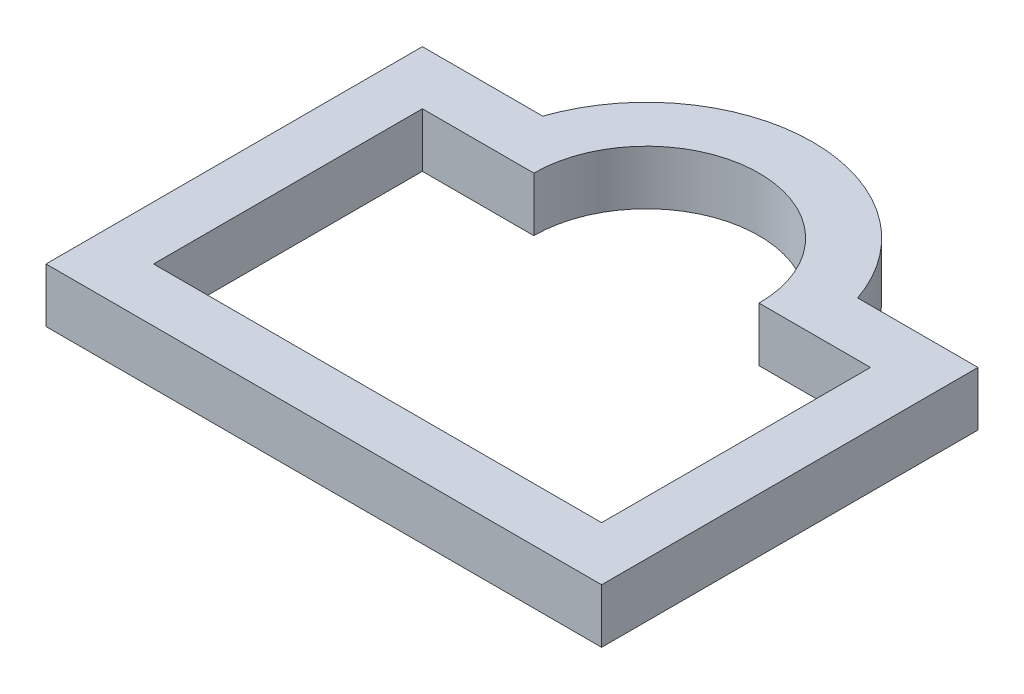
ISO-10303-21;
HEADER;
FILE_DESCRIPTION(('STEP AP214'),'2;1');
FILE_NAME('part.step','',(''),(''),'','','');
FILE_SCHEMA(('AUTOMOTIVE_DESIGN { 1 0 10303 214 1 1 1 1 }'));
ENDSEC;
DATA;
#1=APPLICATION_CONTEXT('core data for automotive mechanical design processes');
#2=APPLICATION_PROTOCOL_DEFINITION('international standard','automotive_design',2000,#1);
#3=PRODUCT_CONTEXT('',#1,'mechanical');
#4=PRODUCT('Part','Part','',(#3));
#5=PRODUCT_RELATED_PRODUCT_CATEGORY('part','',(#4));
#6=PRODUCT_DEFINITION_FORMATION('','',#4);
#7=PRODUCT_DEFINITION_CONTEXT('part definition',#1,'design');
#8=PRODUCT_DEFINITION('design','',#6,#7);
#9=PRODUCT_DEFINITION_SHAPE('','',#8);
#10=(LENGTH_UNIT() NAMED_UNIT(*) SI_UNIT(.MILLI.,.METRE.));
#11=(NAMED_UNIT(*) PLANE_ANGLE_UNIT() SI_UNIT($,.RADIAN.));
#12=(NAMED_UNIT(*) SI_UNIT($,.STERADIAN.) SOLID_ANGLE_UNIT());
#13=UNCERTAINTY_MEASURE_WITH_UNIT(LENGTH_MEASURE(1.E-05),#10,'distance_accuracy_value','');
#14=(GEOMETRIC_REPRESENTATION_CONTEXT(3) GLOBAL_UNCERTAINTY_ASSIGNED_CONTEXT((#13)) GLOBAL_UNIT_ASSIGNED_CONTEXT((#10,
#11,#12)) REPRESENTATION_CONTEXT('',''));
#15=CARTESIAN_POINT('',(0.,0.,0.));
#16=DIRECTION('',(0.,0.,1.));
#17=DIRECTION('',(1.,0.,0.));
#18=AXIS2_PLACEMENT_3D('',#15,#16,#17);
#19=CARTESIAN_POINT('',(125.,30.254,0.));
#20=DIRECTION('',(0.,1.,0.));
#21=DIRECTION('',(0.,0.,1.));
#22=AXIS2_PLACEMENT_3D('',#19,#20,#21);
#23=PLANE('',#22);
#24=CARTESIAN_POINT('',(125.,30.254,0.));
#25=DIRECTION('',(0.,1.,0.));
#26=DIRECTION('',(1.,0.,0.));
#27=AXIS2_PLACEMENT_3D('',#24,#25,#26);
#28=CIRCLE('',#27,92.8280492042157);
#29=CARTESIAN_POINT('',(212.846722870351,30.254,-30.));
#30=VERTEX_POINT('',#29);
#31=CARTESIAN_POINT('',(37.1532771296487,30.254,-30.));
#32=VERTEX_POINT('',#31);
#33=EDGE_CURVE('E234',#30,#32,#28,.T.);
#34=ORIENTED_EDGE('',*,*,#33,.T.);
#35=DIRECTION('',(1.,0.,0.));
#36=VECTOR('',#35,1.);
#37=CARTESIAN_POINT('',(0.,30.254,-30.));
#38=LINE('',#37,#36);
#39=CARTESIAN_POINT('',(-30.,30.254,-30.));
#40=VERTEX_POINT('',#39);
#41=EDGE_CURVE('E237',#40,#32,#38,.T.);
#42=ORIENTED_EDGE('',*,*,#41,.F.);
#43=DIRECTION('',(0.,0.,1.));
#44=VECTOR('',#43,1.);
#45=CARTESIAN_POINT('',(-30.,30.254,0.));
#46=LINE('',#45,#44);
#47=CARTESIAN_POINT('',(-30.,30.254,180.));
#48=VERTEX_POINT('',#47);
#49=EDGE_CURVE('E242',#40,#48,#46,.T.);
#50=ORIENTED_EDGE('',*,*,#49,.T.);
#51=DIRECTION('',(1.,0.,0.));
#52=VECTOR('',#51,1.);
#53=CARTESIAN_POINT('',(0.,30.254,180.));
#54=LINE('',#53,#52);
#55=CARTESIAN_POINT('',(280.,30.254,180.));
#56=VERTEX_POINT('',#55);
#57=EDGE_CURVE('E245',#48,#56,#54,.T.);
#58=ORIENTED_EDGE('',*,*,#57,.T.);
#59=DIRECTION('',(0.,0.,1.));
#60=VECTOR('',#59,1.);
#61=CARTESIAN_POINT('',(280.,30.254,0.));
#62=LINE('',#61,#60);
#63=CARTESIAN_POINT('',(280.,30.254,-30.));
#64=VERTEX_POINT('',#63);
#65=EDGE_CURVE('E248',#64,#56,#62,.T.);
#66=ORIENTED_EDGE('',*,*,#65,.F.);
#67=DIRECTION('',(1.,0.,0.));
#68=VECTOR('',#67,1.);
#69=CARTESIAN_POINT('',(0.,30.254,-30.));
#70=LINE('',#69,#68);
#71=EDGE_CURVE('E252',#30,#64,#70,.T.);
#72=ORIENTED_EDGE('',*,*,#71,.F.);
#73=EDGE_LOOP('',(#34,#42,#50,#58,#66,#72));
#74=FACE_BOUND('',#73,.T.);
#75=DIRECTION('',(1.,0.,0.));
#76=VECTOR('',#75,1.);
#77=CARTESIAN_POINT('',(0.,30.254,0.));
#78=LINE('',#77,#76);
#79=CARTESIAN_POINT('',(0.,30.254,0.));
#80=VERTEX_POINT('',#79);
#81=CARTESIAN_POINT('',(62.1719507957843,30.254,0.));
#82=VERTEX_POINT('',#81);
#83=EDGE_CURVE('E174',#80,#82,#78,.T.);
#84=ORIENTED_EDGE('',*,*,#83,.T.);
#85=CARTESIAN_POINT('',(125.,30.254,0.));
#86=DIRECTION('',(0.,1.,0.));
#87=DIRECTION('',(0.,0.,1.));
#88=AXIS2_PLACEMENT_3D('',#85,#86,#87);
#89=CIRCLE('',#88,62.8280492042157);
#90=CARTESIAN_POINT('',(187.828049204216,30.254,0.));
#91=VERTEX_POINT('',#90);
#92=EDGE_CURVE('E163',#91,#82,#89,.T.);
#93=ORIENTED_EDGE('',*,*,#92,.F.);
#94=DIRECTION('',(1.,0.,0.));
#95=VECTOR('',#94,1.);
#96=CARTESIAN_POINT('',(0.,30.254,0.));
#97=LINE('',#96,#95);
#98=CARTESIAN_POINT('',(250.,30.254,0.));
#99=VERTEX_POINT('',#98);
#100=EDGE_CURVE('E199',#91,#99,#97,.T.);
#101=ORIENTED_EDGE('',*,*,#100,.T.);
#102=DIRECTION('',(0.,0.,1.));
#103=VECTOR('',#102,1.);
#104=CARTESIAN_POINT('',(250.,30.254,0.));
#105=LINE('',#104,#103);
#106=CARTESIAN_POINT('',(250.,30.254,150.));
#107=VERTEX_POINT('',#106);
#108=EDGE_CURVE('E91',#99,#107,#105,.T.);
#109=ORIENTED_EDGE('',*,*,#108,.T.);
#110=DIRECTION('',(1.,0.,0.));
#111=VECTOR('',#110,1.);
#112=CARTESIAN_POINT('',(0.,30.254,150.));
#113=LINE('',#112,#111);
#114=CARTESIAN_POINT('',(0.,30.254,150.));
#115=VERTEX_POINT('',#114);
#116=EDGE_CURVE('E192',#115,#107,#113,.T.);
#117=ORIENTED_EDGE('',*,*,#116,.F.);
#118=DIRECTION('',(0.,0.,1.));
#119=VECTOR('',#118,1.);
#120=CARTESIAN_POINT('',(0.,30.254,0.));
#121=LINE('',#120,#119);
#122=EDGE_CURVE('E188',#80,#115,#121,.T.);
#123=ORIENTED_EDGE('',*,*,#122,.F.);
#124=EDGE_LOOP('',(#84,#93,#101,#109,#117,#123));
#125=FACE_BOUND('',#124,.T.);
#126=ADVANCED_FACE('F75',(#74,#125),#23,.T.);
#127=CARTESIAN_POINT('',(125.,0.,0.));
#128=DIRECTION('',(0.,1.,0.));
#129=DIRECTION('',(0.,0.,1.));
#130=AXIS2_PLACEMENT_3D('',#127,#128,#129);
#131=PLANE('',#130);
#132=CARTESIAN_POINT('',(125.,0.,0.));
#133=DIRECTION('',(0.,1.,0.));
#134=DIRECTION('',(1.,0.,0.));
#135=AXIS2_PLACEMENT_3D('',#132,#133,#134);
#136=CIRCLE('',#135,92.8280492042157);
#137=CARTESIAN_POINT('',(212.846722870351,0.,-30.));
#138=VERTEX_POINT('',#137);
#139=CARTESIAN_POINT('',(37.1532771296487,0.,-30.));
#140=VERTEX_POINT('',#139);
#141=EDGE_CURVE('E184',#138,#140,#136,.T.);
#142=ORIENTED_EDGE('',*,*,#141,.F.);
#143=DIRECTION('',(1.,0.,0.));
#144=VECTOR('',#143,1.);
#145=CARTESIAN_POINT('',(0.,0.,-30.));
#146=LINE('',#145,#144);
#147=CARTESIAN_POINT('',(280.,0.,-30.));
#148=VERTEX_POINT('',#147);
#149=EDGE_CURVE('E238',#138,#148,#146,.T.);
#150=ORIENTED_EDGE('',*,*,#149,.T.);
#151=DIRECTION('',(0.,0.,1.));
#152=VECTOR('',#151,1.);
#153=CARTESIAN_POINT('',(280.,0.,0.));
#154=LINE('',#153,#152);
#155=CARTESIAN_POINT('',(280.,0.,180.));
#156=VERTEX_POINT('',#155);
#157=EDGE_CURVE('E271',#148,#156,#154,.T.);
#158=ORIENTED_EDGE('',*,*,#157,.T.);
#159=DIRECTION('',(1.,0.,0.));
#160=VECTOR('',#159,1.);
#161=CARTESIAN_POINT('',(0.,0.,180.));
#162=LINE('',#161,#160);
#163=CARTESIAN_POINT('',(-30.,0.,180.));
#164=VERTEX_POINT('',#163);
#165=EDGE_CURVE('E267',#164,#156,#162,.T.);
#166=ORIENTED_EDGE('',*,*,#165,.F.);
#167=DIRECTION('',(0.,0.,1.));
#168=VECTOR('',#167,1.);
#169=CARTESIAN_POINT('',(-30.,0.,0.));
#170=LINE('',#169,#168);
#171=CARTESIAN_POINT('',(-30.,0.,-30.));
#172=VERTEX_POINT('',#171);
#173=EDGE_CURVE('E264',#172,#164,#170,.T.);
#174=ORIENTED_EDGE('',*,*,#173,.F.);
#175=DIRECTION('',(1.,0.,0.));
#176=VECTOR('',#175,1.);
#177=CARTESIAN_POINT('',(0.,0.,-30.));
#178=LINE('',#177,#176);
#179=EDGE_CURVE('E260',#172,#140,#178,.T.);
#180=ORIENTED_EDGE('',*,*,#179,.T.);
#181=EDGE_LOOP('',(#142,#150,#158,#166,#174,#180));
#182=FACE_BOUND('',#181,.T.);
#183=CARTESIAN_POINT('',(125.,0.,0.));
#184=DIRECTION('',(0.,1.,0.));
#185=DIRECTION('',(0.,0.,1.));
#186=AXIS2_PLACEMENT_3D('',#183,#184,#185);
#187=CIRCLE('',#186,62.8280492042157);
#188=CARTESIAN_POINT('',(187.828049204216,0.,0.));
#189=VERTEX_POINT('',#188);
#190=CARTESIAN_POINT('',(62.1719507957843,0.,0.));
#191=VERTEX_POINT('',#190);
#192=EDGE_CURVE('E99',#189,#191,#187,.T.);
#193=ORIENTED_EDGE('',*,*,#192,.T.);
#194=DIRECTION('',(1.,0.,0.));
#195=VECTOR('',#194,1.);
#196=CARTESIAN_POINT('',(0.,0.,0.));
#197=LINE('',#196,#195);
#198=CARTESIAN_POINT('',(0.,0.,0.));
#199=VERTEX_POINT('',#198);
#200=EDGE_CURVE('E182',#199,#191,#197,.T.);
#201=ORIENTED_EDGE('',*,*,#200,.F.);
#202=DIRECTION('',(0.,0.,1.));
#203=VECTOR('',#202,1.);
#204=CARTESIAN_POINT('',(0.,0.,0.));
#205=LINE('',#204,#203);
#206=CARTESIAN_POINT('',(0.,0.,150.));
#207=VERTEX_POINT('',#206);
#208=EDGE_CURVE('E206',#199,#207,#205,.T.);
#209=ORIENTED_EDGE('',*,*,#208,.T.);
#210=DIRECTION('',(1.,0.,0.));
#211=VECTOR('',#210,1.);
#212=CARTESIAN_POINT('',(0.,0.,150.));
#213=LINE('',#212,#211);
#214=CARTESIAN_POINT('',(250.,0.,150.));
#215=VERTEX_POINT('',#214);
#216=EDGE_CURVE('E210',#207,#215,#213,.T.);
#217=ORIENTED_EDGE('',*,*,#216,.T.);
#218=DIRECTION('',(0.,0.,1.));
#219=VECTOR('',#218,1.);
#220=CARTESIAN_POINT('',(250.,0.,0.));
#221=LINE('',#220,#219);
#222=CARTESIAN_POINT('',(250.,0.,0.));
#223=VERTEX_POINT('',#222);
#224=EDGE_CURVE('E214',#223,#215,#221,.T.);
#225=ORIENTED_EDGE('',*,*,#224,.F.);
#226=DIRECTION('',(1.,0.,0.));
#227=VECTOR('',#226,1.);
#228=CARTESIAN_POINT('',(0.,0.,0.));
#229=LINE('',#228,#227);
#230=EDGE_CURVE('E175',#189,#223,#229,.T.);
#231=ORIENTED_EDGE('',*,*,#230,.F.);
#232=EDGE_LOOP('',(#193,#201,#209,#217,#225,#231));
#233=FACE_BOUND('',#232,.T.);
#234=ADVANCED_FACE('F301',(#182,#233),#131,.F.);
#235=CARTESIAN_POINT('',(125.,30.254,0.));
#236=DIRECTION('',(0.,-1.,0.));
#237=DIRECTION('',(0.,0.,-1.));
#238=AXIS2_PLACEMENT_3D('',#235,#236,#237);
#239=CYLINDRICAL_SURFACE('',#238,92.8280492042157);
#240=ORIENTED_EDGE('',*,*,#141,.T.);
#241=DIRECTION('',(0.,-1.,0.));
#242=VECTOR('',#241,1.);
#243=CARTESIAN_POINT('',(37.1532771296487,30.254,-30.));
#244=LINE('',#243,#242);
#245=EDGE_CURVE('E12',#32,#140,#244,.T.);
#246=ORIENTED_EDGE('',*,*,#245,.F.);
#247=ORIENTED_EDGE('',*,*,#33,.F.);
#248=DIRECTION('',(0.,-1.,0.));
#249=VECTOR('',#248,1.);
#250=CARTESIAN_POINT('',(212.846722870351,30.254,-30.));
#251=LINE('',#250,#249);
#252=EDGE_CURVE('E256',#30,#138,#251,.T.);
#253=ORIENTED_EDGE('',*,*,#252,.T.);
#254=EDGE_LOOP('',(#240,#246,#247,#253));
#255=FACE_BOUND('',#254,.T.);
#256=ADVANCED_FACE('F77',(#255),#239,.T.);
#257=CARTESIAN_POINT('',(0.,30.254,-30.));
#258=DIRECTION('',(0.,0.,-1.));
#259=DIRECTION('',(-1.,0.,0.));
#260=AXIS2_PLACEMENT_3D('',#257,#258,#259);
#261=PLANE('',#260);
#262=ORIENTED_EDGE('',*,*,#179,.F.);
#263=DIRECTION('',(0.,-1.,0.));
#264=VECTOR('',#263,1.);
#265=CARTESIAN_POINT('',(-30.,30.254,-30.));
#266=LINE('',#265,#264);
#267=EDGE_CURVE('E84',#40,#172,#266,.T.);
#268=ORIENTED_EDGE('',*,*,#267,.F.);
#269=ORIENTED_EDGE('',*,*,#41,.T.);
#270=ORIENTED_EDGE('',*,*,#245,.T.);
#271=EDGE_LOOP('',(#262,#268,#269,#270));
#272=FACE_BOUND('',#271,.T.);
#273=ADVANCED_FACE('F303',(#272),#261,.T.);
#274=CARTESIAN_POINT('',(-30.,30.254,0.));
#275=DIRECTION('',(1.,0.,0.));
#276=DIRECTION('',(0.,0.,-1.));
#277=AXIS2_PLACEMENT_3D('',#274,#275,#276);
#278=PLANE('',#277);
#279=ORIENTED_EDGE('',*,*,#173,.T.);
#280=DIRECTION('',(0.,-1.,0.));
#281=VECTOR('',#280,1.);
#282=CARTESIAN_POINT('',(-30.,30.254,180.));
#283=LINE('',#282,#281);
#284=EDGE_CURVE('E286',#48,#164,#283,.T.);
#285=ORIENTED_EDGE('',*,*,#284,.F.);
#286=ORIENTED_EDGE('',*,*,#49,.F.);
#287=ORIENTED_EDGE('',*,*,#267,.T.);
#288=EDGE_LOOP('',(#279,#285,#286,#287));
#289=FACE_BOUND('',#288,.T.);
#290=ADVANCED_FACE('F293',(#289),#278,.F.);
#291=CARTESIAN_POINT('',(0.,30.254,180.));
#292=DIRECTION('',(0.,0.,-1.));
#293=DIRECTION('',(-1.,0.,0.));
#294=AXIS2_PLACEMENT_3D('',#291,#292,#293);
#295=PLANE('',#294);
#296=ORIENTED_EDGE('',*,*,#165,.T.);
#297=DIRECTION('',(0.,-1.,0.));
#298=VECTOR('',#297,1.);
#299=CARTESIAN_POINT('',(280.,30.254,180.));
#300=LINE('',#299,#298);
#301=EDGE_CURVE('E283',#56,#156,#300,.T.);
#302=ORIENTED_EDGE('',*,*,#301,.F.);
#303=ORIENTED_EDGE('',*,*,#57,.F.);
#304=ORIENTED_EDGE('',*,*,#284,.T.);
#305=EDGE_LOOP('',(#296,#302,#303,#304));
#306=FACE_BOUND('',#305,.T.);
#307=ADVANCED_FACE('F318',(#306),#295,.F.);
#308=CARTESIAN_POINT('',(280.,30.254,0.));
#309=DIRECTION('',(1.,0.,0.));
#310=DIRECTION('',(0.,0.,-1.));
#311=AXIS2_PLACEMENT_3D('',#308,#309,#310);
#312=PLANE('',#311);
#313=ORIENTED_EDGE('',*,*,#157,.F.);
#314=DIRECTION('',(0.,-1.,0.));
#315=VECTOR('',#314,1.);
#316=CARTESIAN_POINT('',(280.,30.254,-30.));
#317=LINE('',#316,#315);
#318=EDGE_CURVE('E280',#64,#148,#317,.T.);
#319=ORIENTED_EDGE('',*,*,#318,.F.);
#320=ORIENTED_EDGE('',*,*,#65,.T.);
#321=ORIENTED_EDGE('',*,*,#301,.T.);
#322=EDGE_LOOP('',(#313,#319,#320,#321));
#323=FACE_BOUND('',#322,.T.);
#324=ADVANCED_FACE('F314',(#323),#312,.T.);
#325=CARTESIAN_POINT('',(0.,30.254,-30.));
#326=DIRECTION('',(0.,0.,-1.));
#327=DIRECTION('',(-1.,0.,0.));
#328=AXIS2_PLACEMENT_3D('',#325,#326,#327);
#329=PLANE('',#328);
#330=ORIENTED_EDGE('',*,*,#149,.F.);
#331=ORIENTED_EDGE('',*,*,#252,.F.);
#332=ORIENTED_EDGE('',*,*,#71,.T.);
#333=ORIENTED_EDGE('',*,*,#318,.T.);
#334=EDGE_LOOP('',(#330,#331,#332,#333));
#335=FACE_BOUND('',#334,.T.);
#336=ADVANCED_FACE('F309',(#335),#329,.T.);
#337=CARTESIAN_POINT('',(125.,30.254,0.));
#338=DIRECTION('',(0.,-1.,0.));
#339=DIRECTION('',(0.,0.,-1.));
#340=AXIS2_PLACEMENT_3D('',#337,#338,#339);
#341=CYLINDRICAL_SURFACE('',#340,62.8280492042157);
#342=ORIENTED_EDGE('',*,*,#192,.F.);
#343=DIRECTION('',(0.,-1.,0.));
#344=VECTOR('',#343,1.);
#345=CARTESIAN_POINT('',(187.828049204216,30.254,0.));
#346=LINE('',#345,#344);
#347=EDGE_CURVE('E168',#91,#189,#346,.T.);
#348=ORIENTED_EDGE('',*,*,#347,.F.);
#349=ORIENTED_EDGE('',*,*,#92,.T.);
#350=DIRECTION('',(0.,-1.,0.));
#351=VECTOR('',#350,1.);
#352=CARTESIAN_POINT('',(62.1719507957843,30.254,0.));
#353=LINE('',#352,#351);
#354=EDGE_CURVE('E166',#82,#191,#353,.T.);
#355=ORIENTED_EDGE('',*,*,#354,.T.);
#356=EDGE_LOOP('',(#342,#348,#349,#355));
#357=FACE_BOUND('',#356,.T.);
#358=ADVANCED_FACE('F165',(#357),#341,.F.);
#359=CARTESIAN_POINT('',(0.,30.254,0.));
#360=DIRECTION('',(0.,0.,-1.));
#361=DIRECTION('',(-1.,0.,0.));
#362=AXIS2_PLACEMENT_3D('',#359,#360,#361);
#363=PLANE('',#362);
#364=ORIENTED_EDGE('',*,*,#200,.T.);
#365=ORIENTED_EDGE('',*,*,#354,.F.);
#366=ORIENTED_EDGE('',*,*,#83,.F.);
#367=DIRECTION('',(0.,-1.,0.));
#368=VECTOR('',#367,1.);
#369=CARTESIAN_POINT('',(0.,30.254,0.));
#370=LINE('',#369,#368);
#371=EDGE_CURVE('E185',#80,#199,#370,.T.);
#372=ORIENTED_EDGE('',*,*,#371,.T.);
#373=EDGE_LOOP('',(#364,#365,#366,#372));
#374=FACE_BOUND('',#373,.T.);
#375=ADVANCED_FACE('F179',(#374),#363,.F.);
#376=CARTESIAN_POINT('',(0.,30.254,0.));
#377=DIRECTION('',(1.,0.,0.));
#378=DIRECTION('',(0.,0.,-1.));
#379=AXIS2_PLACEMENT_3D('',#376,#377,#378);
#380=PLANE('',#379);
#381=ORIENTED_EDGE('',*,*,#208,.F.);
#382=ORIENTED_EDGE('',*,*,#371,.F.);
#383=ORIENTED_EDGE('',*,*,#122,.T.);
#384=DIRECTION('',(0.,-1.,0.));
#385=VECTOR('',#384,1.);
#386=CARTESIAN_POINT('',(0.,30.254,150.));
#387=LINE('',#386,#385);
#388=EDGE_CURVE('E229',#115,#207,#387,.T.);
#389=ORIENTED_EDGE('',*,*,#388,.T.);
#390=EDGE_LOOP('',(#381,#382,#383,#389));
#391=FACE_BOUND('',#390,.T.);
#392=ADVANCED_FACE('F398',(#391),#380,.T.);
#393=CARTESIAN_POINT('',(0.,30.254,150.));
#394=DIRECTION('',(0.,0.,-1.));
#395=DIRECTION('',(-1.,0.,0.));
#396=AXIS2_PLACEMENT_3D('',#393,#394,#395);
#397=PLANE('',#396);
#398=ORIENTED_EDGE('',*,*,#216,.F.);
#399=ORIENTED_EDGE('',*,*,#388,.F.);
#400=ORIENTED_EDGE('',*,*,#116,.T.);
#401=DIRECTION('',(0.,-1.,0.));
#402=VECTOR('',#401,1.);
#403=CARTESIAN_POINT('',(250.,30.254,150.));
#404=LINE('',#403,#402);
#405=EDGE_CURVE('E226',#107,#215,#404,.T.);
#406=ORIENTED_EDGE('',*,*,#405,.T.);
#407=EDGE_LOOP('',(#398,#399,#400,#406));
#408=FACE_BOUND('',#407,.T.);
#409=ADVANCED_FACE('F405',(#408),#397,.T.);
#410=CARTESIAN_POINT('',(250.,30.254,0.));
#411=DIRECTION('',(1.,0.,0.));
#412=DIRECTION('',(0.,0.,-1.));
#413=AXIS2_PLACEMENT_3D('',#410,#411,#412);
#414=PLANE('',#413);
#415=ORIENTED_EDGE('',*,*,#224,.T.);
#416=ORIENTED_EDGE('',*,*,#405,.F.);
#417=ORIENTED_EDGE('',*,*,#108,.F.);
#418=DIRECTION('',(0.,-1.,0.));
#419=VECTOR('',#418,1.);
#420=CARTESIAN_POINT('',(250.,30.254,0.));
#421=LINE('',#420,#419);
#422=EDGE_CURVE('E223',#99,#223,#421,.T.);
#423=ORIENTED_EDGE('',*,*,#422,.T.);
#424=EDGE_LOOP('',(#415,#416,#417,#423));
#425=FACE_BOUND('',#424,.T.);
#426=ADVANCED_FACE('F414',(#425),#414,.F.);
#427=CARTESIAN_POINT('',(0.,30.254,0.));
#428=DIRECTION('',(0.,0.,-1.));
#429=DIRECTION('',(-1.,0.,0.));
#430=AXIS2_PLACEMENT_3D('',#427,#428,#429);
#431=PLANE('',#430);
#432=ORIENTED_EDGE('',*,*,#230,.T.);
#433=ORIENTED_EDGE('',*,*,#422,.F.);
#434=ORIENTED_EDGE('',*,*,#100,.F.);
#435=ORIENTED_EDGE('',*,*,#347,.T.);
#436=EDGE_LOOP('',(#432,#433,#434,#435));
#437=FACE_BOUND('',#436,.T.);
#438=ADVANCED_FACE('F423',(#437),#431,.F.);
#439=CLOSED_SHELL('',(#126,#234,#256,#273,#290,#307,#324,#336,#358,#375,#392,#409,#426,#438));
#440=MANIFOLD_SOLID_BREP('B2',#439);
#441=ADVANCED_BREP_SHAPE_REPRESENTATION('',(#18,#440),#14);
#442=SHAPE_DEFINITION_REPRESENTATION(#9,#441);
ENDSEC;
END-ISO-10303-21;
